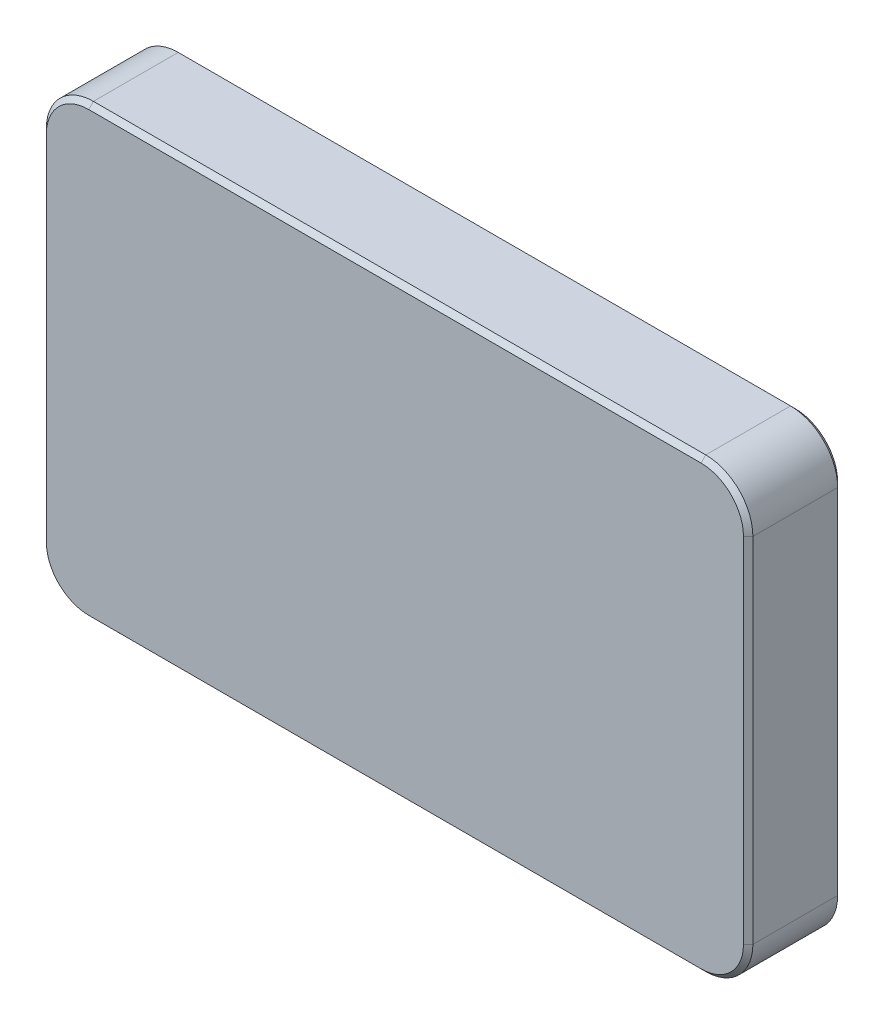
ISO-10303-21;
HEADER;
FILE_DESCRIPTION(('STEP AP214'),'2;1');
FILE_NAME('part.step','',(''),(''),'','','');
FILE_SCHEMA(('AUTOMOTIVE_DESIGN { 1 0 10303 214 1 1 1 1 }'));
ENDSEC;
DATA;
#1=APPLICATION_CONTEXT('core data for automotive mechanical design processes');
#2=APPLICATION_PROTOCOL_DEFINITION('international standard','automotive_design',2000,#1);
#3=PRODUCT_CONTEXT('',#1,'mechanical');
#4=PRODUCT('Part','Part','',(#3));
#5=PRODUCT_RELATED_PRODUCT_CATEGORY('part','',(#4));
#6=PRODUCT_DEFINITION_FORMATION('','',#4);
#7=PRODUCT_DEFINITION_CONTEXT('part definition',#1,'design');
#8=PRODUCT_DEFINITION('design','',#6,#7);
#9=PRODUCT_DEFINITION_SHAPE('','',#8);
#10=(LENGTH_UNIT() NAMED_UNIT(*) SI_UNIT(.MILLI.,.METRE.));
#11=(NAMED_UNIT(*) PLANE_ANGLE_UNIT() SI_UNIT($,.RADIAN.));
#12=(NAMED_UNIT(*) SI_UNIT($,.STERADIAN.) SOLID_ANGLE_UNIT());
#13=UNCERTAINTY_MEASURE_WITH_UNIT(LENGTH_MEASURE(1.E-05),#10,'distance_accuracy_value','');
#14=(GEOMETRIC_REPRESENTATION_CONTEXT(3) GLOBAL_UNCERTAINTY_ASSIGNED_CONTEXT((#13)) GLOBAL_UNIT_ASSIGNED_CONTEXT((#10,
#11,#12)) REPRESENTATION_CONTEXT('',''));
#15=CARTESIAN_POINT('',(0.,0.,0.));
#16=DIRECTION('',(0.,0.,1.));
#17=DIRECTION('',(1.,0.,0.));
#18=AXIS2_PLACEMENT_3D('',#15,#16,#17);
#19=CARTESIAN_POINT('',(-7.5,4.75,2.));
#20=DIRECTION('',(1.,0.,0.));
#21=DIRECTION('',(0.,0.,-1.));
#22=AXIS2_PLACEMENT_3D('',#19,#20,#21);
#23=PLANE('',#22);
#24=DIRECTION('',(0.,0.,-1.));
#25=VECTOR('',#24,1.);
#26=CARTESIAN_POINT('',(-7.5,3.75,2.));
#27=LINE('',#26,#25);
#28=CARTESIAN_POINT('',(-7.5,3.75,1.9));
#29=VERTEX_POINT('',#28);
#30=CARTESIAN_POINT('',(-7.5,3.75,0.0999999999999977));
#31=VERTEX_POINT('',#30);
#32=EDGE_CURVE('E282',#29,#31,#27,.T.);
#33=ORIENTED_EDGE('',*,*,#32,.T.);
#34=DIRECTION('',(0.,-1.,0.));
#35=VECTOR('',#34,1.);
#36=CARTESIAN_POINT('',(-7.5,4.75,0.0999999999999977));
#37=LINE('',#36,#35);
#38=CARTESIAN_POINT('',(-7.5,-3.75,0.0999999999999977));
#39=VERTEX_POINT('',#38);
#40=EDGE_CURVE('E199',#31,#39,#37,.T.);
#41=ORIENTED_EDGE('',*,*,#40,.T.);
#42=DIRECTION('',(0.,0.,-1.));
#43=VECTOR('',#42,1.);
#44=CARTESIAN_POINT('',(-7.5,-3.75,2.));
#45=LINE('',#44,#43);
#46=CARTESIAN_POINT('',(-7.5,-3.75,1.9));
#47=VERTEX_POINT('',#46);
#48=EDGE_CURVE('E287',#39,#47,#45,.F.);
#49=ORIENTED_EDGE('',*,*,#48,.T.);
#50=DIRECTION('',(0.,1.,0.));
#51=VECTOR('',#50,1.);
#52=CARTESIAN_POINT('',(-7.5,3.75,1.9));
#53=LINE('',#52,#51);
#54=EDGE_CURVE('E197',#47,#29,#53,.T.);
#55=ORIENTED_EDGE('',*,*,#54,.T.);
#56=EDGE_LOOP('',(#33,#41,#49,#55));
#57=FACE_BOUND('',#56,.T.);
#58=ADVANCED_FACE('F33',(#57),#23,.F.);
#59=CARTESIAN_POINT('',(-7.5,-4.75,2.));
#60=DIRECTION('',(0.,1.,0.));
#61=DIRECTION('',(0.,0.,1.));
#62=AXIS2_PLACEMENT_3D('',#59,#60,#61);
#63=PLANE('',#62);
#64=DIRECTION('',(0.,0.,-1.));
#65=VECTOR('',#64,1.);
#66=CARTESIAN_POINT('',(-6.5,-4.75,2.));
#67=LINE('',#66,#65);
#68=CARTESIAN_POINT('',(-6.5,-4.75,1.9));
#69=VERTEX_POINT('',#68);
#70=CARTESIAN_POINT('',(-6.5,-4.75,0.0999999999999977));
#71=VERTEX_POINT('',#70);
#72=EDGE_CURVE('E280',#69,#71,#67,.T.);
#73=ORIENTED_EDGE('',*,*,#72,.T.);
#74=DIRECTION('',(1.,0.,0.));
#75=VECTOR('',#74,1.);
#76=CARTESIAN_POINT('',(-7.5,-4.75,0.0999999999999977));
#77=LINE('',#76,#75);
#78=CARTESIAN_POINT('',(6.5,-4.75,0.0999999999999977));
#79=VERTEX_POINT('',#78);
#80=EDGE_CURVE('E207',#71,#79,#77,.T.);
#81=ORIENTED_EDGE('',*,*,#80,.T.);
#82=DIRECTION('',(0.,0.,-1.));
#83=VECTOR('',#82,1.);
#84=CARTESIAN_POINT('',(6.5,-4.75,2.));
#85=LINE('',#84,#83);
#86=CARTESIAN_POINT('',(6.5,-4.75,1.9));
#87=VERTEX_POINT('',#86);
#88=EDGE_CURVE('E238',#79,#87,#85,.F.);
#89=ORIENTED_EDGE('',*,*,#88,.T.);
#90=DIRECTION('',(-1.,0.,0.));
#91=VECTOR('',#90,1.);
#92=CARTESIAN_POINT('',(-6.5,-4.75,1.9));
#93=LINE('',#92,#91);
#94=EDGE_CURVE('E205',#87,#69,#93,.T.);
#95=ORIENTED_EDGE('',*,*,#94,.T.);
#96=EDGE_LOOP('',(#73,#81,#89,#95));
#97=FACE_BOUND('',#96,.T.);
#98=ADVANCED_FACE('F278',(#97),#63,.F.);
#99=CARTESIAN_POINT('',(7.5,4.75,2.));
#100=DIRECTION('',(-1.,0.,0.));
#101=DIRECTION('',(0.,-1.,0.));
#102=AXIS2_PLACEMENT_3D('',#99,#100,#101);
#103=PLANE('',#102);
#104=DIRECTION('',(0.,0.,-1.));
#105=VECTOR('',#104,1.);
#106=CARTESIAN_POINT('',(7.5,-3.75,2.));
#107=LINE('',#106,#105);
#108=CARTESIAN_POINT('',(7.5,-3.75,1.9));
#109=VERTEX_POINT('',#108);
#110=CARTESIAN_POINT('',(7.5,-3.75,0.0999999999999977));
#111=VERTEX_POINT('',#110);
#112=EDGE_CURVE('E166',#109,#111,#107,.T.);
#113=ORIENTED_EDGE('',*,*,#112,.T.);
#114=DIRECTION('',(0.,1.,0.));
#115=VECTOR('',#114,1.);
#116=CARTESIAN_POINT('',(7.5,4.75,0.0999999999999977));
#117=LINE('',#116,#115);
#118=CARTESIAN_POINT('',(7.5,3.75,0.0999999999999977));
#119=VERTEX_POINT('',#118);
#120=EDGE_CURVE('E182',#111,#119,#117,.T.);
#121=ORIENTED_EDGE('',*,*,#120,.T.);
#122=DIRECTION('',(0.,0.,-1.));
#123=VECTOR('',#122,1.);
#124=CARTESIAN_POINT('',(7.5,3.75,2.));
#125=LINE('',#124,#123);
#126=CARTESIAN_POINT('',(7.5,3.75,1.9));
#127=VERTEX_POINT('',#126);
#128=EDGE_CURVE('E296',#119,#127,#125,.F.);
#129=ORIENTED_EDGE('',*,*,#128,.T.);
#130=DIRECTION('',(0.,-1.,0.));
#131=VECTOR('',#130,1.);
#132=CARTESIAN_POINT('',(7.5,-3.75,1.9));
#133=LINE('',#132,#131);
#134=EDGE_CURVE('E180',#127,#109,#133,.T.);
#135=ORIENTED_EDGE('',*,*,#134,.T.);
#136=EDGE_LOOP('',(#113,#121,#129,#135));
#137=FACE_BOUND('',#136,.T.);
#138=ADVANCED_FACE('F318',(#137),#103,.F.);
#139=CARTESIAN_POINT('',(-7.5,4.75,2.));
#140=DIRECTION('',(0.,-1.,0.));
#141=DIRECTION('',(0.,0.,-1.));
#142=AXIS2_PLACEMENT_3D('',#139,#140,#141);
#143=PLANE('',#142);
#144=DIRECTION('',(0.,0.,-1.));
#145=VECTOR('',#144,1.);
#146=CARTESIAN_POINT('',(6.5,4.75,2.));
#147=LINE('',#146,#145);
#148=CARTESIAN_POINT('',(6.5,4.75,1.9));
#149=VERTEX_POINT('',#148);
#150=CARTESIAN_POINT('',(6.5,4.75,0.0999999999999977));
#151=VERTEX_POINT('',#150);
#152=EDGE_CURVE('E290',#149,#151,#147,.T.);
#153=ORIENTED_EDGE('',*,*,#152,.T.);
#154=DIRECTION('',(-1.,0.,0.));
#155=VECTOR('',#154,1.);
#156=CARTESIAN_POINT('',(-7.5,4.75,0.0999999999999977));
#157=LINE('',#156,#155);
#158=CARTESIAN_POINT('',(-6.5,4.75,0.0999999999999977));
#159=VERTEX_POINT('',#158);
#160=EDGE_CURVE('E190',#151,#159,#157,.T.);
#161=ORIENTED_EDGE('',*,*,#160,.T.);
#162=DIRECTION('',(0.,0.,-1.));
#163=VECTOR('',#162,1.);
#164=CARTESIAN_POINT('',(-6.5,4.75,2.));
#165=LINE('',#164,#163);
#166=CARTESIAN_POINT('',(-6.5,4.75,1.9));
#167=VERTEX_POINT('',#166);
#168=EDGE_CURVE('E293',#159,#167,#165,.F.);
#169=ORIENTED_EDGE('',*,*,#168,.T.);
#170=DIRECTION('',(1.,0.,0.));
#171=VECTOR('',#170,1.);
#172=CARTESIAN_POINT('',(6.5,4.75,1.9));
#173=LINE('',#172,#171);
#174=EDGE_CURVE('E188',#167,#149,#173,.T.);
#175=ORIENTED_EDGE('',*,*,#174,.T.);
#176=EDGE_LOOP('',(#153,#161,#169,#175));
#177=FACE_BOUND('',#176,.T.);
#178=ADVANCED_FACE('F361',(#177),#143,.F.);
#179=CARTESIAN_POINT('',(0.,0.,2.));
#180=DIRECTION('',(0.,0.,1.));
#181=DIRECTION('',(1.,0.,0.));
#182=AXIS2_PLACEMENT_3D('',#179,#180,#181);
#183=PLANE('',#182);
#184=DIRECTION('',(-1.,0.,0.));
#185=VECTOR('',#184,1.);
#186=CARTESIAN_POINT('',(-6.5,4.65,2.));
#187=LINE('',#186,#185);
#188=CARTESIAN_POINT('',(6.5,4.65,2.));
#189=VERTEX_POINT('',#188);
#190=CARTESIAN_POINT('',(-6.5,4.65,2.));
#191=VERTEX_POINT('',#190);
#192=EDGE_CURVE('E42',#189,#191,#187,.T.);
#193=ORIENTED_EDGE('',*,*,#192,.T.);
#194=CARTESIAN_POINT('',(-6.5,3.75,2.));
#195=DIRECTION('',(0.,0.,1.));
#196=DIRECTION('',(1.,0.,0.));
#197=AXIS2_PLACEMENT_3D('',#194,#195,#196);
#198=CIRCLE('',#197,0.899999999999999);
#199=CARTESIAN_POINT('',(-7.4,3.75,2.));
#200=VERTEX_POINT('',#199);
#201=EDGE_CURVE('E11',#191,#200,#198,.T.);
#202=ORIENTED_EDGE('',*,*,#201,.T.);
#203=DIRECTION('',(0.,-1.,0.));
#204=VECTOR('',#203,1.);
#205=CARTESIAN_POINT('',(-7.4,-3.75,2.));
#206=LINE('',#205,#204);
#207=CARTESIAN_POINT('',(-7.4,-3.75,2.));
#208=VERTEX_POINT('',#207);
#209=EDGE_CURVE('E209',#200,#208,#206,.T.);
#210=ORIENTED_EDGE('',*,*,#209,.T.);
#211=CARTESIAN_POINT('',(-6.5,-3.75,2.));
#212=DIRECTION('',(0.,0.,1.));
#213=DIRECTION('',(1.,0.,0.));
#214=AXIS2_PLACEMENT_3D('',#211,#212,#213);
#215=CIRCLE('',#214,0.899999999999999);
#216=CARTESIAN_POINT('',(-6.5,-4.65,2.));
#217=VERTEX_POINT('',#216);
#218=EDGE_CURVE('E211',#208,#217,#215,.T.);
#219=ORIENTED_EDGE('',*,*,#218,.T.);
#220=DIRECTION('',(1.,0.,0.));
#221=VECTOR('',#220,1.);
#222=CARTESIAN_POINT('',(6.5,-4.65,2.));
#223=LINE('',#222,#221);
#224=CARTESIAN_POINT('',(6.5,-4.65,2.));
#225=VERTEX_POINT('',#224);
#226=EDGE_CURVE('E213',#217,#225,#223,.T.);
#227=ORIENTED_EDGE('',*,*,#226,.T.);
#228=CARTESIAN_POINT('',(6.5,-3.75,2.));
#229=DIRECTION('',(0.,0.,1.));
#230=DIRECTION('',(1.,0.,0.));
#231=AXIS2_PLACEMENT_3D('',#228,#229,#230);
#232=CIRCLE('',#231,0.899999999999999);
#233=CARTESIAN_POINT('',(7.4,-3.75,2.));
#234=VERTEX_POINT('',#233);
#235=EDGE_CURVE('E215',#225,#234,#232,.T.);
#236=ORIENTED_EDGE('',*,*,#235,.T.);
#237=DIRECTION('',(0.,1.,0.));
#238=VECTOR('',#237,1.);
#239=CARTESIAN_POINT('',(7.4,3.75,2.));
#240=LINE('',#239,#238);
#241=CARTESIAN_POINT('',(7.4,3.75,2.));
#242=VERTEX_POINT('',#241);
#243=EDGE_CURVE('E217',#234,#242,#240,.T.);
#244=ORIENTED_EDGE('',*,*,#243,.T.);
#245=CARTESIAN_POINT('',(6.5,3.75,2.));
#246=DIRECTION('',(0.,0.,1.));
#247=DIRECTION('',(1.,0.,0.));
#248=AXIS2_PLACEMENT_3D('',#245,#246,#247);
#249=CIRCLE('',#248,0.899999999999999);
#250=EDGE_CURVE('E53',#242,#189,#249,.T.);
#251=ORIENTED_EDGE('',*,*,#250,.T.);
#252=EDGE_LOOP('',(#193,#202,#210,#219,#227,#236,#244,#251));
#253=FACE_BOUND('',#252,.T.);
#254=ADVANCED_FACE('F334',(#253),#183,.T.);
#255=CARTESIAN_POINT('',(0.,0.,0.));
#256=DIRECTION('',(0.,0.,1.));
#257=DIRECTION('',(1.,0.,0.));
#258=AXIS2_PLACEMENT_3D('',#255,#256,#257);
#259=PLANE('',#258);
#260=DIRECTION('',(0.,-1.,0.));
#261=VECTOR('',#260,1.);
#262=CARTESIAN_POINT('',(7.4,0.,0.));
#263=LINE('',#262,#261);
#264=CARTESIAN_POINT('',(7.4,3.75,0.));
#265=VERTEX_POINT('',#264);
#266=CARTESIAN_POINT('',(7.4,-3.75,0.));
#267=VERTEX_POINT('',#266);
#268=EDGE_CURVE('E170',#265,#267,#263,.T.);
#269=ORIENTED_EDGE('',*,*,#268,.T.);
#270=CARTESIAN_POINT('',(6.5,-3.75,0.));
#271=DIRECTION('',(0.,0.,1.));
#272=DIRECTION('',(1.,0.,0.));
#273=AXIS2_PLACEMENT_3D('',#270,#271,#272);
#274=CIRCLE('',#273,0.900000000000002);
#275=CARTESIAN_POINT('',(6.5,-4.65,0.));
#276=VERTEX_POINT('',#275);
#277=EDGE_CURVE('E151',#267,#276,#274,.F.);
#278=ORIENTED_EDGE('',*,*,#277,.T.);
#279=DIRECTION('',(-1.,0.,0.));
#280=VECTOR('',#279,1.);
#281=CARTESIAN_POINT('',(0.,-4.65,0.));
#282=LINE('',#281,#280);
#283=CARTESIAN_POINT('',(-6.5,-4.65,0.));
#284=VERTEX_POINT('',#283);
#285=EDGE_CURVE('E159',#276,#284,#282,.T.);
#286=ORIENTED_EDGE('',*,*,#285,.T.);
#287=CARTESIAN_POINT('',(-6.5,-3.75,0.));
#288=DIRECTION('',(0.,0.,1.));
#289=DIRECTION('',(1.,0.,0.));
#290=AXIS2_PLACEMENT_3D('',#287,#288,#289);
#291=CIRCLE('',#290,0.900000000000002);
#292=CARTESIAN_POINT('',(-7.40000000000001,-3.75,0.));
#293=VERTEX_POINT('',#292);
#294=EDGE_CURVE('E165',#284,#293,#291,.F.);
#295=ORIENTED_EDGE('',*,*,#294,.T.);
#296=DIRECTION('',(0.,1.,0.));
#297=VECTOR('',#296,1.);
#298=CARTESIAN_POINT('',(-7.40000000000001,0.,0.));
#299=LINE('',#298,#297);
#300=CARTESIAN_POINT('',(-7.40000000000001,3.75,0.));
#301=VERTEX_POINT('',#300);
#302=EDGE_CURVE('E301',#293,#301,#299,.T.);
#303=ORIENTED_EDGE('',*,*,#302,.T.);
#304=CARTESIAN_POINT('',(-6.5,3.75,0.));
#305=DIRECTION('',(0.,0.,1.));
#306=DIRECTION('',(1.,0.,0.));
#307=AXIS2_PLACEMENT_3D('',#304,#305,#306);
#308=CIRCLE('',#307,0.900000000000002);
#309=CARTESIAN_POINT('',(-6.5,4.65000000000001,0.));
#310=VERTEX_POINT('',#309);
#311=EDGE_CURVE('E303',#301,#310,#308,.F.);
#312=ORIENTED_EDGE('',*,*,#311,.T.);
#313=DIRECTION('',(1.,0.,0.));
#314=VECTOR('',#313,1.);
#315=CARTESIAN_POINT('',(0.,4.65000000000001,0.));
#316=LINE('',#315,#314);
#317=CARTESIAN_POINT('',(6.5,4.65000000000001,0.));
#318=VERTEX_POINT('',#317);
#319=EDGE_CURVE('E305',#310,#318,#316,.T.);
#320=ORIENTED_EDGE('',*,*,#319,.T.);
#321=CARTESIAN_POINT('',(6.5,3.75,0.));
#322=DIRECTION('',(0.,0.,1.));
#323=DIRECTION('',(1.,0.,0.));
#324=AXIS2_PLACEMENT_3D('',#321,#322,#323);
#325=CIRCLE('',#324,0.900000000000002);
#326=EDGE_CURVE('E175',#318,#265,#325,.F.);
#327=ORIENTED_EDGE('',*,*,#326,.T.);
#328=EDGE_LOOP('',(#269,#278,#286,#295,#303,#312,#320,#327));
#329=FACE_BOUND('',#328,.T.);
#330=ADVANCED_FACE('F168',(#329),#259,.F.);
#331=CARTESIAN_POINT('',(-6.5,-3.75,2.));
#332=DIRECTION('',(0.,0.,-1.));
#333=DIRECTION('',(-1.,0.,0.));
#334=AXIS2_PLACEMENT_3D('',#331,#332,#333);
#335=CYLINDRICAL_SURFACE('',#334,1.);
#336=ORIENTED_EDGE('',*,*,#48,.F.);
#337=CARTESIAN_POINT('',(-6.5,-3.75,0.0999999999999977));
#338=DIRECTION('',(0.,0.,1.));
#339=DIRECTION('',(1.,0.,0.));
#340=AXIS2_PLACEMENT_3D('',#337,#338,#339);
#341=CIRCLE('',#340,1.);
#342=EDGE_CURVE('E203',#39,#71,#341,.T.);
#343=ORIENTED_EDGE('',*,*,#342,.T.);
#344=ORIENTED_EDGE('',*,*,#72,.F.);
#345=CARTESIAN_POINT('',(-6.5,-3.75,1.9));
#346=DIRECTION('',(0.,0.,1.));
#347=DIRECTION('',(1.,0.,0.));
#348=AXIS2_PLACEMENT_3D('',#345,#346,#347);
#349=CIRCLE('',#348,1.);
#350=EDGE_CURVE('E201',#69,#47,#349,.F.);
#351=ORIENTED_EDGE('',*,*,#350,.T.);
#352=EDGE_LOOP('',(#336,#343,#344,#351));
#353=FACE_BOUND('',#352,.T.);
#354=ADVANCED_FACE('F378',(#353),#335,.T.);
#355=CARTESIAN_POINT('',(-6.5,3.75,2.));
#356=DIRECTION('',(0.,0.,-1.));
#357=DIRECTION('',(-1.,0.,0.));
#358=AXIS2_PLACEMENT_3D('',#355,#356,#357);
#359=CYLINDRICAL_SURFACE('',#358,1.);
#360=ORIENTED_EDGE('',*,*,#168,.F.);
#361=CARTESIAN_POINT('',(-6.5,3.75,0.0999999999999977));
#362=DIRECTION('',(0.,0.,1.));
#363=DIRECTION('',(1.,0.,0.));
#364=AXIS2_PLACEMENT_3D('',#361,#362,#363);
#365=CIRCLE('',#364,1.);
#366=EDGE_CURVE('E195',#159,#31,#365,.T.);
#367=ORIENTED_EDGE('',*,*,#366,.T.);
#368=ORIENTED_EDGE('',*,*,#32,.F.);
#369=CARTESIAN_POINT('',(-6.5,3.75,1.9));
#370=DIRECTION('',(0.,0.,1.));
#371=DIRECTION('',(1.,0.,0.));
#372=AXIS2_PLACEMENT_3D('',#369,#370,#371);
#373=CIRCLE('',#372,1.);
#374=EDGE_CURVE('E192',#29,#167,#373,.F.);
#375=ORIENTED_EDGE('',*,*,#374,.T.);
#376=EDGE_LOOP('',(#360,#367,#368,#375));
#377=FACE_BOUND('',#376,.T.);
#378=ADVANCED_FACE('F350',(#377),#359,.T.);
#379=CARTESIAN_POINT('',(6.5,-3.75,2.));
#380=DIRECTION('',(0.,0.,-1.));
#381=DIRECTION('',(-1.,0.,0.));
#382=AXIS2_PLACEMENT_3D('',#379,#380,#381);
#383=CYLINDRICAL_SURFACE('',#382,1.);
#384=ORIENTED_EDGE('',*,*,#88,.F.);
#385=CARTESIAN_POINT('',(6.5,-3.75,0.0999999999999977));
#386=DIRECTION('',(0.,0.,1.));
#387=DIRECTION('',(1.,0.,0.));
#388=AXIS2_PLACEMENT_3D('',#385,#386,#387);
#389=CIRCLE('',#388,1.);
#390=EDGE_CURVE('E153',#79,#111,#389,.T.);
#391=ORIENTED_EDGE('',*,*,#390,.T.);
#392=ORIENTED_EDGE('',*,*,#112,.F.);
#393=CARTESIAN_POINT('',(6.5,-3.75,1.9));
#394=DIRECTION('',(0.,0.,1.));
#395=DIRECTION('',(1.,0.,0.));
#396=AXIS2_PLACEMENT_3D('',#393,#394,#395);
#397=CIRCLE('',#396,1.);
#398=EDGE_CURVE('E172',#109,#87,#397,.F.);
#399=ORIENTED_EDGE('',*,*,#398,.T.);
#400=EDGE_LOOP('',(#384,#391,#392,#399));
#401=FACE_BOUND('',#400,.T.);
#402=ADVANCED_FACE('F274',(#401),#383,.T.);
#403=CARTESIAN_POINT('',(6.5,3.75,2.));
#404=DIRECTION('',(0.,0.,-1.));
#405=DIRECTION('',(-1.,0.,0.));
#406=AXIS2_PLACEMENT_3D('',#403,#404,#405);
#407=CYLINDRICAL_SURFACE('',#406,1.);
#408=ORIENTED_EDGE('',*,*,#128,.F.);
#409=CARTESIAN_POINT('',(6.5,3.75,0.0999999999999977));
#410=DIRECTION('',(0.,0.,1.));
#411=DIRECTION('',(1.,0.,0.));
#412=AXIS2_PLACEMENT_3D('',#409,#410,#411);
#413=CIRCLE('',#412,1.);
#414=EDGE_CURVE('E186',#119,#151,#413,.T.);
#415=ORIENTED_EDGE('',*,*,#414,.T.);
#416=ORIENTED_EDGE('',*,*,#152,.F.);
#417=CARTESIAN_POINT('',(6.5,3.75,1.9));
#418=DIRECTION('',(0.,0.,1.));
#419=DIRECTION('',(1.,0.,0.));
#420=AXIS2_PLACEMENT_3D('',#417,#418,#419);
#421=CIRCLE('',#420,1.);
#422=EDGE_CURVE('E184',#149,#127,#421,.F.);
#423=ORIENTED_EDGE('',*,*,#422,.T.);
#424=EDGE_LOOP('',(#408,#415,#416,#423));
#425=FACE_BOUND('',#424,.T.);
#426=ADVANCED_FACE('F320',(#425),#407,.T.);
#427=CARTESIAN_POINT('',(-6.5,3.75,0.));
#428=DIRECTION('',(0.,0.,1.));
#429=DIRECTION('',(1.,0.,0.));
#430=AXIS2_PLACEMENT_3D('',#427,#428,#429);
#431=CONICAL_SURFACE('',#430,0.900000000000002,0.785398163397448);
#432=DIRECTION('',(0.707106781186547,0.,-0.707106781186547));
#433=VECTOR('',#432,1.);
#434=CARTESIAN_POINT('',(-7.5,3.75,0.0999999999999977));
#435=LINE('',#434,#433);
#436=EDGE_CURVE('E232',#31,#301,#435,.T.);
#437=ORIENTED_EDGE('',*,*,#436,.F.);
#438=ORIENTED_EDGE('',*,*,#366,.F.);
#439=DIRECTION('',(0.,0.707106781186547,0.707106781186547));
#440=VECTOR('',#439,1.);
#441=CARTESIAN_POINT('',(-6.5,4.65000000000001,0.));
#442=LINE('',#441,#440);
#443=EDGE_CURVE('E235',#310,#159,#442,.T.);
#444=ORIENTED_EDGE('',*,*,#443,.F.);
#445=ORIENTED_EDGE('',*,*,#311,.F.);
#446=EDGE_LOOP('',(#437,#438,#444,#445));
#447=FACE_BOUND('',#446,.T.);
#448=ADVANCED_FACE('F354',(#447),#431,.T.);
#449=CARTESIAN_POINT('',(-7.5,4.75,0.0999999999999977));
#450=DIRECTION('',(0.,-0.707106781186547,0.707106781186547));
#451=DIRECTION('',(-1.,0.,0.));
#452=AXIS2_PLACEMENT_3D('',#449,#450,#451);
#453=PLANE('',#452);
#454=ORIENTED_EDGE('',*,*,#443,.T.);
#455=ORIENTED_EDGE('',*,*,#160,.F.);
#456=DIRECTION('',(0.,0.707106781186547,0.707106781186547));
#457=VECTOR('',#456,1.);
#458=CARTESIAN_POINT('',(6.5,4.65000000000001,0.));
#459=LINE('',#458,#457);
#460=EDGE_CURVE('E229',#318,#151,#459,.T.);
#461=ORIENTED_EDGE('',*,*,#460,.F.);
#462=ORIENTED_EDGE('',*,*,#319,.F.);
#463=EDGE_LOOP('',(#454,#455,#461,#462));
#464=FACE_BOUND('',#463,.T.);
#465=ADVANCED_FACE('F359',(#464),#453,.F.);
#466=CARTESIAN_POINT('',(-7.5,4.75,0.0999999999999977));
#467=DIRECTION('',(0.707106781186547,0.,0.707106781186547));
#468=DIRECTION('',(0.,-1.,0.));
#469=AXIS2_PLACEMENT_3D('',#466,#467,#468);
#470=PLANE('',#469);
#471=ORIENTED_EDGE('',*,*,#436,.T.);
#472=ORIENTED_EDGE('',*,*,#302,.F.);
#473=DIRECTION('',(0.707106781186547,0.,-0.707106781186547));
#474=VECTOR('',#473,1.);
#475=CARTESIAN_POINT('',(-7.5,-3.75,0.0999999999999977));
#476=LINE('',#475,#474);
#477=EDGE_CURVE('E226',#39,#293,#476,.T.);
#478=ORIENTED_EDGE('',*,*,#477,.F.);
#479=ORIENTED_EDGE('',*,*,#40,.F.);
#480=EDGE_LOOP('',(#471,#472,#478,#479));
#481=FACE_BOUND('',#480,.T.);
#482=ADVANCED_FACE('F400',(#481),#470,.F.);
#483=CARTESIAN_POINT('',(6.5,3.75,0.));
#484=DIRECTION('',(0.,0.,1.));
#485=DIRECTION('',(1.,0.,0.));
#486=AXIS2_PLACEMENT_3D('',#483,#484,#485);
#487=CONICAL_SURFACE('',#486,0.900000000000002,0.785398163397448);
#488=ORIENTED_EDGE('',*,*,#460,.T.);
#489=ORIENTED_EDGE('',*,*,#414,.F.);
#490=DIRECTION('',(0.707106781186547,0.,0.707106781186547));
#491=VECTOR('',#490,1.);
#492=CARTESIAN_POINT('',(7.4,3.75,0.));
#493=LINE('',#492,#491);
#494=EDGE_CURVE('E223',#265,#119,#493,.T.);
#495=ORIENTED_EDGE('',*,*,#494,.F.);
#496=ORIENTED_EDGE('',*,*,#326,.F.);
#497=EDGE_LOOP('',(#488,#489,#495,#496));
#498=FACE_BOUND('',#497,.T.);
#499=ADVANCED_FACE('F312',(#498),#487,.T.);
#500=CARTESIAN_POINT('',(-6.5,-3.75,0.));
#501=DIRECTION('',(0.,0.,1.));
#502=DIRECTION('',(1.,0.,0.));
#503=AXIS2_PLACEMENT_3D('',#500,#501,#502);
#504=CONICAL_SURFACE('',#503,0.900000000000002,0.785398163397448);
#505=ORIENTED_EDGE('',*,*,#477,.T.);
#506=ORIENTED_EDGE('',*,*,#294,.F.);
#507=DIRECTION('',(0.,0.707106781186547,-0.707106781186547));
#508=VECTOR('',#507,1.);
#509=CARTESIAN_POINT('',(-6.5,-4.75,0.0999999999999977));
#510=LINE('',#509,#508);
#511=EDGE_CURVE('E162',#71,#284,#510,.T.);
#512=ORIENTED_EDGE('',*,*,#511,.F.);
#513=ORIENTED_EDGE('',*,*,#342,.F.);
#514=EDGE_LOOP('',(#505,#506,#512,#513));
#515=FACE_BOUND('',#514,.T.);
#516=ADVANCED_FACE('F394',(#515),#504,.T.);
#517=CARTESIAN_POINT('',(7.5,4.75,0.0999999999999977));
#518=DIRECTION('',(-0.707106781186547,0.,0.707106781186547));
#519=DIRECTION('',(0.,1.,0.));
#520=AXIS2_PLACEMENT_3D('',#517,#518,#519);
#521=PLANE('',#520);
#522=ORIENTED_EDGE('',*,*,#494,.T.);
#523=ORIENTED_EDGE('',*,*,#120,.F.);
#524=DIRECTION('',(0.707106781186548,0.,0.707106781186547));
#525=VECTOR('',#524,1.);
#526=CARTESIAN_POINT('',(7.4,-3.75,0.));
#527=LINE('',#526,#525);
#528=EDGE_CURVE('E156',#267,#111,#527,.T.);
#529=ORIENTED_EDGE('',*,*,#528,.F.);
#530=ORIENTED_EDGE('',*,*,#268,.F.);
#531=EDGE_LOOP('',(#522,#523,#529,#530));
#532=FACE_BOUND('',#531,.T.);
#533=ADVANCED_FACE('F315',(#532),#521,.F.);
#534=CARTESIAN_POINT('',(-7.5,-4.75,0.0999999999999977));
#535=DIRECTION('',(0.,0.707106781186547,0.707106781186547));
#536=DIRECTION('',(1.,0.,0.));
#537=AXIS2_PLACEMENT_3D('',#534,#535,#536);
#538=PLANE('',#537);
#539=ORIENTED_EDGE('',*,*,#511,.T.);
#540=ORIENTED_EDGE('',*,*,#285,.F.);
#541=DIRECTION('',(0.,0.707106781186547,-0.707106781186547));
#542=VECTOR('',#541,1.);
#543=CARTESIAN_POINT('',(6.5,-4.75,0.0999999999999977));
#544=LINE('',#543,#542);
#545=EDGE_CURVE('E147',#79,#276,#544,.T.);
#546=ORIENTED_EDGE('',*,*,#545,.F.);
#547=ORIENTED_EDGE('',*,*,#80,.F.);
#548=EDGE_LOOP('',(#539,#540,#546,#547));
#549=FACE_BOUND('',#548,.T.);
#550=ADVANCED_FACE('F160',(#549),#538,.F.);
#551=CARTESIAN_POINT('',(6.5,-3.75,0.));
#552=DIRECTION('',(0.,0.,1.));
#553=DIRECTION('',(1.,0.,0.));
#554=AXIS2_PLACEMENT_3D('',#551,#552,#553);
#555=CONICAL_SURFACE('',#554,0.900000000000002,0.785398163397448);
#556=ORIENTED_EDGE('',*,*,#528,.T.);
#557=ORIENTED_EDGE('',*,*,#390,.F.);
#558=ORIENTED_EDGE('',*,*,#545,.T.);
#559=ORIENTED_EDGE('',*,*,#277,.F.);
#560=EDGE_LOOP('',(#556,#557,#558,#559));
#561=FACE_BOUND('',#560,.T.);
#562=ADVANCED_FACE('F149',(#561),#555,.T.);
#563=CARTESIAN_POINT('',(6.5,-3.75,2.));
#564=DIRECTION('',(0.,0.,-1.));
#565=DIRECTION('',(-1.,0.,0.));
#566=AXIS2_PLACEMENT_3D('',#563,#564,#565);
#567=CONICAL_SURFACE('',#566,0.899999999999999,0.785398163397457);
#568=DIRECTION('',(0.,0.707106781186554,0.707106781186541));
#569=VECTOR('',#568,1.);
#570=CARTESIAN_POINT('',(6.5,-4.75,1.9));
#571=LINE('',#570,#569);
#572=EDGE_CURVE('E254',#87,#225,#571,.T.);
#573=ORIENTED_EDGE('',*,*,#572,.F.);
#574=ORIENTED_EDGE('',*,*,#398,.F.);
#575=DIRECTION('',(0.707106781186554,0.,-0.707106781186541));
#576=VECTOR('',#575,1.);
#577=CARTESIAN_POINT('',(7.4,-3.75,2.));
#578=LINE('',#577,#576);
#579=EDGE_CURVE('E37',#234,#109,#578,.T.);
#580=ORIENTED_EDGE('',*,*,#579,.F.);
#581=ORIENTED_EDGE('',*,*,#235,.F.);
#582=EDGE_LOOP('',(#573,#574,#580,#581));
#583=FACE_BOUND('',#582,.T.);
#584=ADVANCED_FACE('F35',(#583),#567,.T.);
#585=CARTESIAN_POINT('',(7.4,0.,2.));
#586=DIRECTION('',(0.707106781186541,0.,0.707106781186554));
#587=DIRECTION('',(0.,-1.,0.));
#588=AXIS2_PLACEMENT_3D('',#585,#586,#587);
#589=PLANE('',#588);
#590=ORIENTED_EDGE('',*,*,#579,.T.);
#591=ORIENTED_EDGE('',*,*,#134,.F.);
#592=DIRECTION('',(0.707106781186554,0.,-0.707106781186541));
#593=VECTOR('',#592,1.);
#594=CARTESIAN_POINT('',(7.4,3.75,2.));
#595=LINE('',#594,#593);
#596=EDGE_CURVE('E252',#242,#127,#595,.T.);
#597=ORIENTED_EDGE('',*,*,#596,.F.);
#598=ORIENTED_EDGE('',*,*,#243,.F.);
#599=EDGE_LOOP('',(#590,#591,#597,#598));
#600=FACE_BOUND('',#599,.T.);
#601=ADVANCED_FACE('F265',(#600),#589,.T.);
#602=CARTESIAN_POINT('',(0.,-4.65,2.));
#603=DIRECTION('',(0.,-0.707106781186541,0.707106781186554));
#604=DIRECTION('',(-1.,0.,0.));
#605=AXIS2_PLACEMENT_3D('',#602,#603,#604);
#606=PLANE('',#605);
#607=ORIENTED_EDGE('',*,*,#572,.T.);
#608=ORIENTED_EDGE('',*,*,#226,.F.);
#609=DIRECTION('',(0.,0.707106781186554,0.707106781186541));
#610=VECTOR('',#609,1.);
#611=CARTESIAN_POINT('',(-6.5,-4.75,1.9));
#612=LINE('',#611,#610);
#613=EDGE_CURVE('E249',#69,#217,#612,.T.);
#614=ORIENTED_EDGE('',*,*,#613,.F.);
#615=ORIENTED_EDGE('',*,*,#94,.F.);
#616=EDGE_LOOP('',(#607,#608,#614,#615));
#617=FACE_BOUND('',#616,.T.);
#618=ADVANCED_FACE('F418',(#617),#606,.T.);
#619=CARTESIAN_POINT('',(6.5,3.75,2.));
#620=DIRECTION('',(0.,0.,-1.));
#621=DIRECTION('',(-1.,0.,0.));
#622=AXIS2_PLACEMENT_3D('',#619,#620,#621);
#623=CONICAL_SURFACE('',#622,0.899999999999999,0.785398163397457);
#624=ORIENTED_EDGE('',*,*,#596,.T.);
#625=ORIENTED_EDGE('',*,*,#422,.F.);
#626=DIRECTION('',(0.,0.707106781186554,-0.707106781186541));
#627=VECTOR('',#626,1.);
#628=CARTESIAN_POINT('',(6.5,4.65,2.));
#629=LINE('',#628,#627);
#630=EDGE_CURVE('E246',#189,#149,#629,.T.);
#631=ORIENTED_EDGE('',*,*,#630,.F.);
#632=ORIENTED_EDGE('',*,*,#250,.F.);
#633=EDGE_LOOP('',(#624,#625,#631,#632));
#634=FACE_BOUND('',#633,.T.);
#635=ADVANCED_FACE('F324',(#634),#623,.T.);
#636=CARTESIAN_POINT('',(-6.5,-3.75,2.));
#637=DIRECTION('',(0.,0.,-1.));
#638=DIRECTION('',(-1.,0.,0.));
#639=AXIS2_PLACEMENT_3D('',#636,#637,#638);
#640=CONICAL_SURFACE('',#639,0.899999999999999,0.785398163397457);
#641=ORIENTED_EDGE('',*,*,#613,.T.);
#642=ORIENTED_EDGE('',*,*,#218,.F.);
#643=DIRECTION('',(0.707106781186554,0.,0.707106781186541));
#644=VECTOR('',#643,1.);
#645=CARTESIAN_POINT('',(-7.5,-3.75,1.9));
#646=LINE('',#645,#644);
#647=EDGE_CURVE('E243',#47,#208,#646,.T.);
#648=ORIENTED_EDGE('',*,*,#647,.F.);
#649=ORIENTED_EDGE('',*,*,#350,.F.);
#650=EDGE_LOOP('',(#641,#642,#648,#649));
#651=FACE_BOUND('',#650,.T.);
#652=ADVANCED_FACE('F339',(#651),#640,.T.);
#653=CARTESIAN_POINT('',(0.,4.65,2.));
#654=DIRECTION('',(0.,0.707106781186541,0.707106781186554));
#655=DIRECTION('',(1.,0.,0.));
#656=AXIS2_PLACEMENT_3D('',#653,#654,#655);
#657=PLANE('',#656);
#658=ORIENTED_EDGE('',*,*,#630,.T.);
#659=ORIENTED_EDGE('',*,*,#174,.F.);
#660=DIRECTION('',(0.,0.707106781186554,-0.707106781186541));
#661=VECTOR('',#660,1.);
#662=CARTESIAN_POINT('',(-6.5,4.65,2.));
#663=LINE('',#662,#661);
#664=EDGE_CURVE('E241',#191,#167,#663,.T.);
#665=ORIENTED_EDGE('',*,*,#664,.F.);
#666=ORIENTED_EDGE('',*,*,#192,.F.);
#667=EDGE_LOOP('',(#658,#659,#665,#666));
#668=FACE_BOUND('',#667,.T.);
#669=ADVANCED_FACE('F327',(#668),#657,.T.);
#670=CARTESIAN_POINT('',(-7.4,0.,2.));
#671=DIRECTION('',(-0.707106781186541,0.,0.707106781186554));
#672=DIRECTION('',(0.,1.,0.));
#673=AXIS2_PLACEMENT_3D('',#670,#671,#672);
#674=PLANE('',#673);
#675=ORIENTED_EDGE('',*,*,#647,.T.);
#676=ORIENTED_EDGE('',*,*,#209,.F.);
#677=DIRECTION('',(0.707106781186554,0.,0.707106781186541));
#678=VECTOR('',#677,1.);
#679=CARTESIAN_POINT('',(-7.5,3.75,1.9));
#680=LINE('',#679,#678);
#681=EDGE_CURVE('E239',#29,#200,#680,.T.);
#682=ORIENTED_EDGE('',*,*,#681,.F.);
#683=ORIENTED_EDGE('',*,*,#54,.F.);
#684=EDGE_LOOP('',(#675,#676,#682,#683));
#685=FACE_BOUND('',#684,.T.);
#686=ADVANCED_FACE('F343',(#685),#674,.T.);
#687=CARTESIAN_POINT('',(-6.5,3.75,2.));
#688=DIRECTION('',(0.,0.,-1.));
#689=DIRECTION('',(-1.,0.,0.));
#690=AXIS2_PLACEMENT_3D('',#687,#688,#689);
#691=CONICAL_SURFACE('',#690,0.899999999999999,0.785398163397457);
#692=ORIENTED_EDGE('',*,*,#664,.T.);
#693=ORIENTED_EDGE('',*,*,#374,.F.);
#694=ORIENTED_EDGE('',*,*,#681,.T.);
#695=ORIENTED_EDGE('',*,*,#201,.F.);
#696=EDGE_LOOP('',(#692,#693,#694,#695));
#697=FACE_BOUND('',#696,.T.);
#698=ADVANCED_FACE('F331',(#697),#691,.T.);
#699=CLOSED_SHELL('',(#58,#98,#138,#178,#254,#330,#354,#378,#402,#426,#448,#465,#482,#499,#516,
#533,#550,#562,#584,#601,#618,#635,#652,#669,#686,#698));
#700=MANIFOLD_SOLID_BREP('B2',#699);
#701=ADVANCED_BREP_SHAPE_REPRESENTATION('',(#18,#700),#14);
#702=SHAPE_DEFINITION_REPRESENTATION(#9,#701);
ENDSEC;
END-ISO-10303-21;
